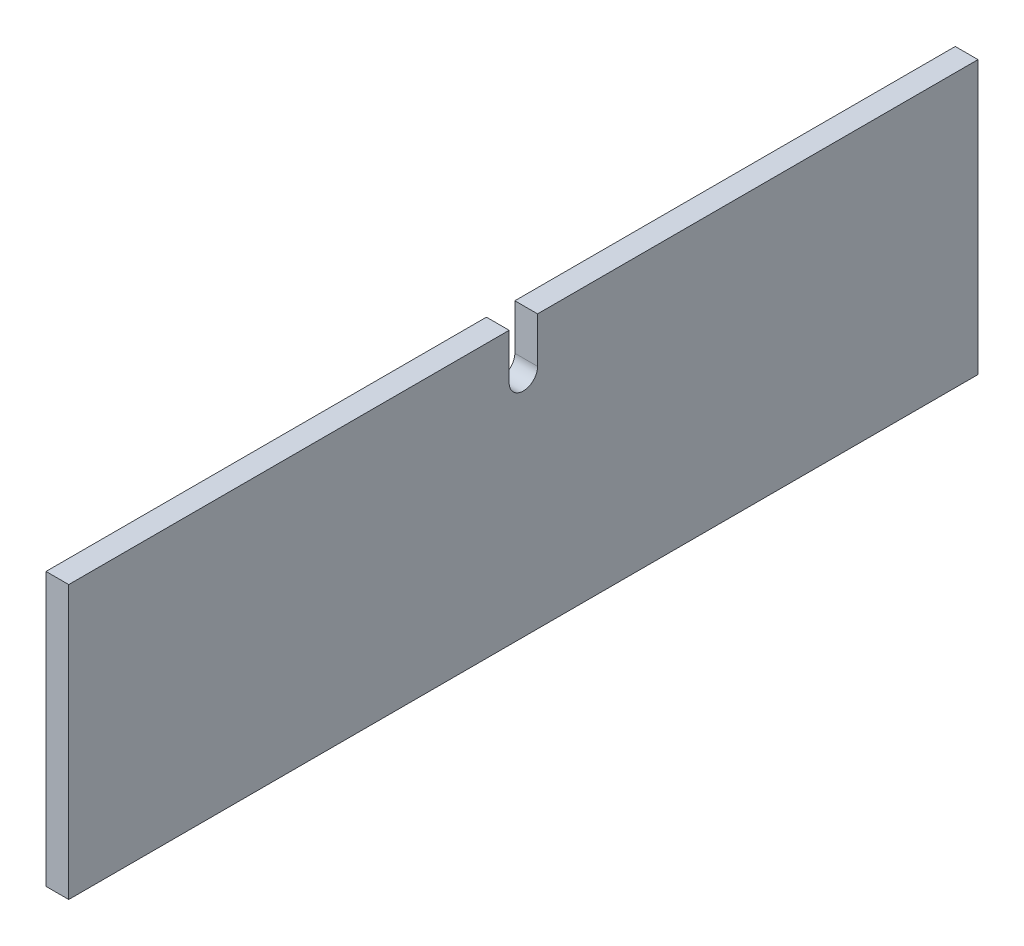
ISO-10303-21;
HEADER;
FILE_DESCRIPTION(('STEP AP214'),'2;1');
FILE_NAME('part.step','',(''),(''),'','','');
FILE_SCHEMA(('AUTOMOTIVE_DESIGN { 1 0 10303 214 1 1 1 1 }'));
ENDSEC;
DATA;
#1=APPLICATION_CONTEXT('core data for automotive mechanical design processes');
#2=APPLICATION_PROTOCOL_DEFINITION('international standard','automotive_design',2000,#1);
#3=PRODUCT_CONTEXT('',#1,'mechanical');
#4=PRODUCT('Part','Part','',(#3));
#5=PRODUCT_RELATED_PRODUCT_CATEGORY('part','',(#4));
#6=PRODUCT_DEFINITION_FORMATION('','',#4);
#7=PRODUCT_DEFINITION_CONTEXT('part definition',#1,'design');
#8=PRODUCT_DEFINITION('design','',#6,#7);
#9=PRODUCT_DEFINITION_SHAPE('','',#8);
#10=(LENGTH_UNIT() NAMED_UNIT(*) SI_UNIT(.MILLI.,.METRE.));
#11=(NAMED_UNIT(*) PLANE_ANGLE_UNIT() SI_UNIT($,.RADIAN.));
#12=(NAMED_UNIT(*) SI_UNIT($,.STERADIAN.) SOLID_ANGLE_UNIT());
#13=UNCERTAINTY_MEASURE_WITH_UNIT(LENGTH_MEASURE(1.E-05),#10,'distance_accuracy_value','');
#14=(GEOMETRIC_REPRESENTATION_CONTEXT(3) GLOBAL_UNCERTAINTY_ASSIGNED_CONTEXT((#13)) GLOBAL_UNIT_ASSIGNED_CONTEXT((#10,
#11,#12)) REPRESENTATION_CONTEXT('',''));
#15=CARTESIAN_POINT('',(0.,0.,0.));
#16=DIRECTION('',(0.,0.,1.));
#17=DIRECTION('',(1.,0.,0.));
#18=AXIS2_PLACEMENT_3D('',#15,#16,#17);
#19=CARTESIAN_POINT('',(25.4,0.,0.));
#20=DIRECTION('',(-1.,0.,0.));
#21=DIRECTION('',(0.,0.,1.));
#22=AXIS2_PLACEMENT_3D('',#19,#20,#21);
#23=CYLINDRICAL_SURFACE('',#22,15.875);
#24=CARTESIAN_POINT('',(0.,0.,0.));
#25=DIRECTION('',(1.,0.,0.));
#26=DIRECTION('',(0.,0.,-1.));
#27=AXIS2_PLACEMENT_3D('',#24,#25,#26);
#28=CIRCLE('',#27,15.875);
#29=CARTESIAN_POINT('',(0.,0.,15.875));
#30=VERTEX_POINT('',#29);
#31=CARTESIAN_POINT('',(0.,0.,-15.875));
#32=VERTEX_POINT('',#31);
#33=EDGE_CURVE('E177',#30,#32,#28,.T.);
#34=ORIENTED_EDGE('',*,*,#33,.F.);
#35=DIRECTION('',(-1.,0.,0.));
#36=VECTOR('',#35,1.);
#37=CARTESIAN_POINT('',(25.4,0.,15.875));
#38=LINE('',#37,#36);
#39=CARTESIAN_POINT('',(25.4,0.,15.875));
#40=VERTEX_POINT('',#39);
#41=EDGE_CURVE('E12',#40,#30,#38,.T.);
#42=ORIENTED_EDGE('',*,*,#41,.F.);
#43=CARTESIAN_POINT('',(25.4,0.,0.));
#44=DIRECTION('',(1.,0.,0.));
#45=DIRECTION('',(0.,0.,-1.));
#46=AXIS2_PLACEMENT_3D('',#43,#44,#45);
#47=CIRCLE('',#46,15.875);
#48=CARTESIAN_POINT('',(25.4,0.,-15.875));
#49=VERTEX_POINT('',#48);
#50=EDGE_CURVE('E148',#40,#49,#47,.T.);
#51=ORIENTED_EDGE('',*,*,#50,.T.);
#52=DIRECTION('',(-1.,0.,0.));
#53=VECTOR('',#52,1.);
#54=CARTESIAN_POINT('',(25.4,0.,-15.875));
#55=LINE('',#54,#53);
#56=EDGE_CURVE('E65',#49,#32,#55,.T.);
#57=ORIENTED_EDGE('',*,*,#56,.T.);
#58=EDGE_LOOP('',(#34,#42,#51,#57));
#59=FACE_BOUND('',#58,.T.);
#60=ADVANCED_FACE('F49',(#59),#23,.F.);
#61=CARTESIAN_POINT('',(25.4,0.,15.875));
#62=DIRECTION('',(0.,0.,1.));
#63=DIRECTION('',(1.,0.,0.));
#64=AXIS2_PLACEMENT_3D('',#61,#62,#63);
#65=PLANE('',#64);
#66=DIRECTION('',(0.,1.,0.));
#67=VECTOR('',#66,1.);
#68=CARTESIAN_POINT('',(0.,0.,15.875));
#69=LINE('',#68,#67);
#70=CARTESIAN_POINT('',(0.,50.8,15.875));
#71=VERTEX_POINT('',#70);
#72=EDGE_CURVE('E175',#30,#71,#69,.T.);
#73=ORIENTED_EDGE('',*,*,#72,.T.);
#74=DIRECTION('',(-1.,0.,0.));
#75=VECTOR('',#74,1.);
#76=CARTESIAN_POINT('',(25.4,50.8,15.875));
#77=LINE('',#76,#75);
#78=CARTESIAN_POINT('',(25.4,50.8,15.875));
#79=VERTEX_POINT('',#78);
#80=EDGE_CURVE('E57',#79,#71,#77,.T.);
#81=ORIENTED_EDGE('',*,*,#80,.F.);
#82=DIRECTION('',(0.,1.,0.));
#83=VECTOR('',#82,1.);
#84=CARTESIAN_POINT('',(25.4,0.,15.875));
#85=LINE('',#84,#83);
#86=EDGE_CURVE('E144',#40,#79,#85,.T.);
#87=ORIENTED_EDGE('',*,*,#86,.F.);
#88=ORIENTED_EDGE('',*,*,#41,.T.);
#89=EDGE_LOOP('',(#73,#81,#87,#88));
#90=FACE_BOUND('',#89,.T.);
#91=ADVANCED_FACE('F176',(#90),#65,.F.);
#92=CARTESIAN_POINT('',(25.4,50.8,0.));
#93=DIRECTION('',(0.,1.,0.));
#94=DIRECTION('',(0.,0.,1.));
#95=AXIS2_PLACEMENT_3D('',#92,#93,#94);
#96=PLANE('',#95);
#97=DIRECTION('',(0.,0.,-1.));
#98=VECTOR('',#97,1.);
#99=CARTESIAN_POINT('',(0.,50.8,0.));
#100=LINE('',#99,#98);
#101=CARTESIAN_POINT('',(0.,50.8,508.));
#102=VERTEX_POINT('',#101);
#103=EDGE_CURVE('E158',#102,#71,#100,.T.);
#104=ORIENTED_EDGE('',*,*,#103,.F.);
#105=DIRECTION('',(-1.,0.,0.));
#106=VECTOR('',#105,1.);
#107=CARTESIAN_POINT('',(25.4,50.8,508.));
#108=LINE('',#107,#106);
#109=CARTESIAN_POINT('',(25.4,50.8,508.));
#110=VERTEX_POINT('',#109);
#111=EDGE_CURVE('E168',#110,#102,#108,.T.);
#112=ORIENTED_EDGE('',*,*,#111,.F.);
#113=DIRECTION('',(0.,0.,-1.));
#114=VECTOR('',#113,1.);
#115=CARTESIAN_POINT('',(25.4,50.8,0.));
#116=LINE('',#115,#114);
#117=EDGE_CURVE('E139',#110,#79,#116,.T.);
#118=ORIENTED_EDGE('',*,*,#117,.T.);
#119=ORIENTED_EDGE('',*,*,#80,.T.);
#120=EDGE_LOOP('',(#104,#112,#118,#119));
#121=FACE_BOUND('',#120,.T.);
#122=ADVANCED_FACE('F171',(#121),#96,.T.);
#123=CARTESIAN_POINT('',(25.4,0.,508.));
#124=DIRECTION('',(0.,0.,-1.));
#125=DIRECTION('',(-1.,0.,0.));
#126=AXIS2_PLACEMENT_3D('',#123,#124,#125);
#127=PLANE('',#126);
#128=DIRECTION('',(0.,-1.,0.));
#129=VECTOR('',#128,1.);
#130=CARTESIAN_POINT('',(0.,0.,508.));
#131=LINE('',#130,#129);
#132=CARTESIAN_POINT('',(0.,-254.,508.));
#133=VERTEX_POINT('',#132);
#134=EDGE_CURVE('E182',#102,#133,#131,.T.);
#135=ORIENTED_EDGE('',*,*,#134,.T.);
#136=DIRECTION('',(-1.,0.,0.));
#137=VECTOR('',#136,1.);
#138=CARTESIAN_POINT('',(25.4,-254.,508.));
#139=LINE('',#138,#137);
#140=CARTESIAN_POINT('',(25.4,-254.,508.));
#141=VERTEX_POINT('',#140);
#142=EDGE_CURVE('E165',#141,#133,#139,.T.);
#143=ORIENTED_EDGE('',*,*,#142,.F.);
#144=DIRECTION('',(0.,-1.,0.));
#145=VECTOR('',#144,1.);
#146=CARTESIAN_POINT('',(25.4,0.,508.));
#147=LINE('',#146,#145);
#148=EDGE_CURVE('E143',#110,#141,#147,.T.);
#149=ORIENTED_EDGE('',*,*,#148,.F.);
#150=ORIENTED_EDGE('',*,*,#111,.T.);
#151=EDGE_LOOP('',(#135,#143,#149,#150));
#152=FACE_BOUND('',#151,.T.);
#153=ADVANCED_FACE('F192',(#152),#127,.F.);
#154=CARTESIAN_POINT('',(25.4,-254.,0.));
#155=DIRECTION('',(0.,1.,0.));
#156=DIRECTION('',(0.,0.,1.));
#157=AXIS2_PLACEMENT_3D('',#154,#155,#156);
#158=PLANE('',#157);
#159=DIRECTION('',(0.,0.,-1.));
#160=VECTOR('',#159,1.);
#161=CARTESIAN_POINT('',(0.,-254.,0.));
#162=LINE('',#161,#160);
#163=CARTESIAN_POINT('',(0.,-254.,-508.));
#164=VERTEX_POINT('',#163);
#165=EDGE_CURVE('E183',#133,#164,#162,.T.);
#166=ORIENTED_EDGE('',*,*,#165,.T.);
#167=DIRECTION('',(-1.,0.,0.));
#168=VECTOR('',#167,1.);
#169=CARTESIAN_POINT('',(25.4,-254.,-508.));
#170=LINE('',#169,#168);
#171=CARTESIAN_POINT('',(25.4,-254.,-508.));
#172=VERTEX_POINT('',#171);
#173=EDGE_CURVE('E124',#172,#164,#170,.T.);
#174=ORIENTED_EDGE('',*,*,#173,.F.);
#175=DIRECTION('',(0.,0.,-1.));
#176=VECTOR('',#175,1.);
#177=CARTESIAN_POINT('',(25.4,-254.,0.));
#178=LINE('',#177,#176);
#179=EDGE_CURVE('E133',#141,#172,#178,.T.);
#180=ORIENTED_EDGE('',*,*,#179,.F.);
#181=ORIENTED_EDGE('',*,*,#142,.T.);
#182=EDGE_LOOP('',(#166,#174,#180,#181));
#183=FACE_BOUND('',#182,.T.);
#184=ADVANCED_FACE('F188',(#183),#158,.F.);
#185=CARTESIAN_POINT('',(25.4,0.,-508.));
#186=DIRECTION('',(0.,0.,-1.));
#187=DIRECTION('',(-1.,0.,0.));
#188=AXIS2_PLACEMENT_3D('',#185,#186,#187);
#189=PLANE('',#188);
#190=DIRECTION('',(0.,-1.,0.));
#191=VECTOR('',#190,1.);
#192=CARTESIAN_POINT('',(0.,0.,-508.));
#193=LINE('',#192,#191);
#194=CARTESIAN_POINT('',(0.,50.8,-508.));
#195=VERTEX_POINT('',#194);
#196=EDGE_CURVE('E120',#195,#164,#193,.T.);
#197=ORIENTED_EDGE('',*,*,#196,.F.);
#198=DIRECTION('',(-1.,0.,0.));
#199=VECTOR('',#198,1.);
#200=CARTESIAN_POINT('',(25.4,50.8,-508.));
#201=LINE('',#200,#199);
#202=CARTESIAN_POINT('',(25.4,50.8,-508.));
#203=VERTEX_POINT('',#202);
#204=EDGE_CURVE('E115',#203,#195,#201,.T.);
#205=ORIENTED_EDGE('',*,*,#204,.F.);
#206=DIRECTION('',(0.,-1.,0.));
#207=VECTOR('',#206,1.);
#208=CARTESIAN_POINT('',(25.4,0.,-508.));
#209=LINE('',#208,#207);
#210=EDGE_CURVE('E118',#203,#172,#209,.T.);
#211=ORIENTED_EDGE('',*,*,#210,.T.);
#212=ORIENTED_EDGE('',*,*,#173,.T.);
#213=EDGE_LOOP('',(#197,#205,#211,#212));
#214=FACE_BOUND('',#213,.T.);
#215=ADVANCED_FACE('F117',(#214),#189,.T.);
#216=CARTESIAN_POINT('',(0.,50.8,-15.875));
#217=VERTEX_POINT('',#216);
#218=EDGE_CURVE('E154',#217,#195,#100,.T.);
#219=ORIENTED_EDGE('',*,*,#218,.F.);
#220=DIRECTION('',(-1.,0.,0.));
#221=VECTOR('',#220,1.);
#222=CARTESIAN_POINT('',(25.4,50.8,-15.875));
#223=LINE('',#222,#221);
#224=CARTESIAN_POINT('',(25.4,50.8,-15.875));
#225=VERTEX_POINT('',#224);
#226=EDGE_CURVE('E90',#225,#217,#223,.T.);
#227=ORIENTED_EDGE('',*,*,#226,.F.);
#228=EDGE_CURVE('E131',#225,#203,#116,.T.);
#229=ORIENTED_EDGE('',*,*,#228,.T.);
#230=ORIENTED_EDGE('',*,*,#204,.T.);
#231=EDGE_LOOP('',(#219,#227,#229,#230));
#232=FACE_BOUND('',#231,.T.);
#233=ADVANCED_FACE('F136',(#232),#96,.T.);
#234=CARTESIAN_POINT('',(25.4,0.,-15.875));
#235=DIRECTION('',(0.,0.,1.));
#236=DIRECTION('',(1.,0.,0.));
#237=AXIS2_PLACEMENT_3D('',#234,#235,#236);
#238=PLANE('',#237);
#239=DIRECTION('',(0.,1.,0.));
#240=VECTOR('',#239,1.);
#241=CARTESIAN_POINT('',(0.,0.,-15.875));
#242=LINE('',#241,#240);
#243=EDGE_CURVE('E150',#32,#217,#242,.T.);
#244=ORIENTED_EDGE('',*,*,#243,.F.);
#245=ORIENTED_EDGE('',*,*,#56,.F.);
#246=DIRECTION('',(0.,1.,0.));
#247=VECTOR('',#246,1.);
#248=CARTESIAN_POINT('',(25.4,0.,-15.875));
#249=LINE('',#248,#247);
#250=EDGE_CURVE('E137',#49,#225,#249,.T.);
#251=ORIENTED_EDGE('',*,*,#250,.T.);
#252=ORIENTED_EDGE('',*,*,#226,.T.);
#253=EDGE_LOOP('',(#244,#245,#251,#252));
#254=FACE_BOUND('',#253,.T.);
#255=ADVANCED_FACE('F206',(#254),#238,.T.);
#256=CARTESIAN_POINT('',(25.4,0.,0.));
#257=DIRECTION('',(1.,0.,0.));
#258=DIRECTION('',(0.,0.,-1.));
#259=AXIS2_PLACEMENT_3D('',#256,#257,#258);
#260=PLANE('',#259);
#261=ORIENTED_EDGE('',*,*,#50,.F.);
#262=ORIENTED_EDGE('',*,*,#86,.T.);
#263=ORIENTED_EDGE('',*,*,#117,.F.);
#264=ORIENTED_EDGE('',*,*,#148,.T.);
#265=ORIENTED_EDGE('',*,*,#179,.T.);
#266=ORIENTED_EDGE('',*,*,#210,.F.);
#267=ORIENTED_EDGE('',*,*,#228,.F.);
#268=ORIENTED_EDGE('',*,*,#250,.F.);
#269=EDGE_LOOP('',(#261,#262,#263,#264,#265,#266,#267,#268));
#270=FACE_BOUND('',#269,.T.);
#271=ADVANCED_FACE('F129',(#270),#260,.T.);
#272=CARTESIAN_POINT('',(0.,0.,0.));
#273=DIRECTION('',(1.,0.,0.));
#274=DIRECTION('',(0.,0.,-1.));
#275=AXIS2_PLACEMENT_3D('',#272,#273,#274);
#276=PLANE('',#275);
#277=ORIENTED_EDGE('',*,*,#33,.T.);
#278=ORIENTED_EDGE('',*,*,#243,.T.);
#279=ORIENTED_EDGE('',*,*,#218,.T.);
#280=ORIENTED_EDGE('',*,*,#196,.T.);
#281=ORIENTED_EDGE('',*,*,#165,.F.);
#282=ORIENTED_EDGE('',*,*,#134,.F.);
#283=ORIENTED_EDGE('',*,*,#103,.T.);
#284=ORIENTED_EDGE('',*,*,#72,.F.);
#285=EDGE_LOOP('',(#277,#278,#279,#280,#281,#282,#283,#284));
#286=FACE_BOUND('',#285,.T.);
#287=ADVANCED_FACE('F180',(#286),#276,.F.);
#288=CLOSED_SHELL('',(#60,#91,#122,#153,#184,#215,#233,#255,#271,#287));
#289=MANIFOLD_SOLID_BREP('B2',#288);
#290=ADVANCED_BREP_SHAPE_REPRESENTATION('',(#18,#289),#14);
#291=SHAPE_DEFINITION_REPRESENTATION(#9,#290);
ENDSEC;
END-ISO-10303-21;
